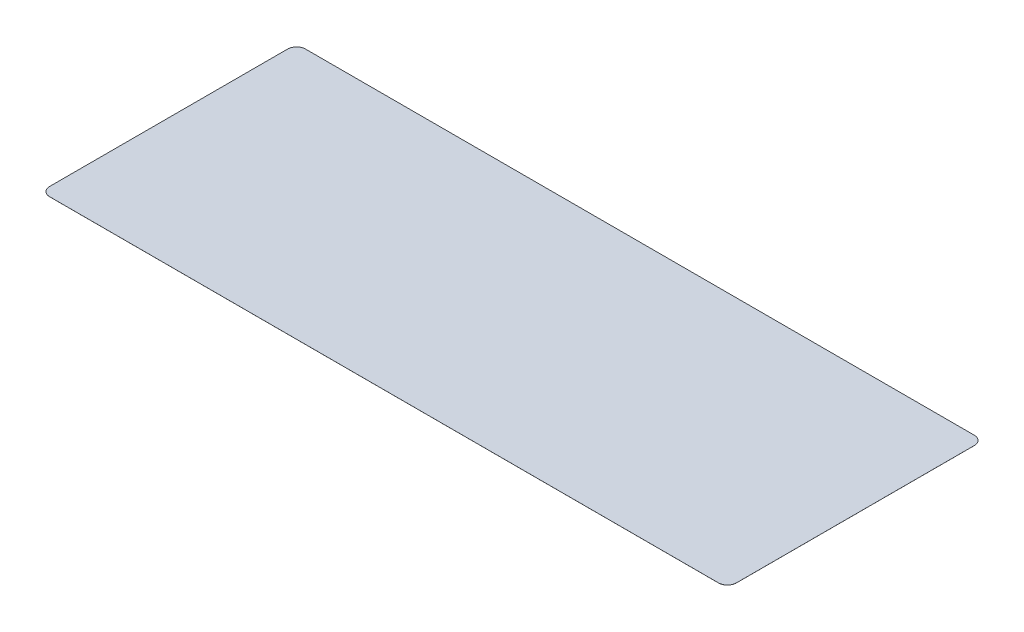
ISO-10303-21;
HEADER;
FILE_DESCRIPTION(('STEP AP214'),'2;1');
FILE_NAME('part.step','',(''),(''),'','','');
FILE_SCHEMA(('AUTOMOTIVE_DESIGN { 1 0 10303 214 1 1 1 1 }'));
ENDSEC;
DATA;
#1=APPLICATION_CONTEXT('core data for automotive mechanical design processes');
#2=APPLICATION_PROTOCOL_DEFINITION('international standard','automotive_design',2000,#1);
#3=PRODUCT_CONTEXT('',#1,'mechanical');
#4=PRODUCT('Part','Part','',(#3));
#5=PRODUCT_RELATED_PRODUCT_CATEGORY('part','',(#4));
#6=PRODUCT_DEFINITION_FORMATION('','',#4);
#7=PRODUCT_DEFINITION_CONTEXT('part definition',#1,'design');
#8=PRODUCT_DEFINITION('design','',#6,#7);
#9=PRODUCT_DEFINITION_SHAPE('','',#8);
#10=(LENGTH_UNIT() NAMED_UNIT(*) SI_UNIT(.MILLI.,.METRE.));
#11=(NAMED_UNIT(*) PLANE_ANGLE_UNIT() SI_UNIT($,.RADIAN.));
#12=(NAMED_UNIT(*) SI_UNIT($,.STERADIAN.) SOLID_ANGLE_UNIT());
#13=UNCERTAINTY_MEASURE_WITH_UNIT(LENGTH_MEASURE(1.E-05),#10,'distance_accuracy_value','');
#14=(GEOMETRIC_REPRESENTATION_CONTEXT(3) GLOBAL_UNCERTAINTY_ASSIGNED_CONTEXT((#13)) GLOBAL_UNIT_ASSIGNED_CONTEXT((#10,
#11,#12)) REPRESENTATION_CONTEXT('',''));
#15=CARTESIAN_POINT('',(0.,0.,0.));
#16=DIRECTION('',(0.,0.,1.));
#17=DIRECTION('',(1.,0.,0.));
#18=AXIS2_PLACEMENT_3D('',#15,#16,#17);
#19=CARTESIAN_POINT('',(946.150000000001,0.127,336.55));
#20=DIRECTION('',(0.,-1.,0.));
#21=DIRECTION('',(0.,0.,-1.));
#22=AXIS2_PLACEMENT_3D('',#19,#20,#21);
#23=CYLINDRICAL_SURFACE('',#22,25.4);
#24=CARTESIAN_POINT('',(946.150000000001,0.,336.55));
#25=DIRECTION('',(0.,1.,0.));
#26=DIRECTION('',(0.,0.,1.));
#27=AXIS2_PLACEMENT_3D('',#24,#25,#26);
#28=CIRCLE('',#27,25.4);
#29=CARTESIAN_POINT('',(946.150000000001,0.,361.95));
#30=VERTEX_POINT('',#29);
#31=CARTESIAN_POINT('',(971.550000000001,0.,336.55));
#32=VERTEX_POINT('',#31);
#33=EDGE_CURVE('E131',#30,#32,#28,.T.);
#34=ORIENTED_EDGE('',*,*,#33,.T.);
#35=DIRECTION('',(0.,-1.,0.));
#36=VECTOR('',#35,1.);
#37=CARTESIAN_POINT('',(971.550000000001,0.127,336.55));
#38=LINE('',#37,#36);
#39=CARTESIAN_POINT('',(971.550000000001,0.127,336.55));
#40=VERTEX_POINT('',#39);
#41=EDGE_CURVE('E11',#40,#32,#38,.T.);
#42=ORIENTED_EDGE('',*,*,#41,.F.);
#43=CARTESIAN_POINT('',(946.150000000001,0.127,336.55));
#44=DIRECTION('',(0.,1.,0.));
#45=DIRECTION('',(0.,0.,1.));
#46=AXIS2_PLACEMENT_3D('',#43,#44,#45);
#47=CIRCLE('',#46,25.4);
#48=CARTESIAN_POINT('',(946.150000000001,0.127,361.95));
#49=VERTEX_POINT('',#48);
#50=EDGE_CURVE('E145',#49,#40,#47,.T.);
#51=ORIENTED_EDGE('',*,*,#50,.F.);
#52=DIRECTION('',(0.,-1.,0.));
#53=VECTOR('',#52,1.);
#54=CARTESIAN_POINT('',(946.150000000001,0.127,361.95));
#55=LINE('',#54,#53);
#56=EDGE_CURVE('E127',#49,#30,#55,.T.);
#57=ORIENTED_EDGE('',*,*,#56,.T.);
#58=EDGE_LOOP('',(#34,#42,#51,#57));
#59=FACE_BOUND('',#58,.T.);
#60=ADVANCED_FACE('F35',(#59),#23,.T.);
#61=CARTESIAN_POINT('',(971.550000000001,0.127,-336.55));
#62=DIRECTION('',(-1.,0.,0.));
#63=DIRECTION('',(0.,0.,1.));
#64=AXIS2_PLACEMENT_3D('',#61,#62,#63);
#65=PLANE('',#64);
#66=DIRECTION('',(0.,0.,-1.));
#67=VECTOR('',#66,1.);
#68=CARTESIAN_POINT('',(971.550000000001,0.,-336.55));
#69=LINE('',#68,#67);
#70=CARTESIAN_POINT('',(971.550000000001,0.,-336.55));
#71=VERTEX_POINT('',#70);
#72=EDGE_CURVE('E134',#32,#71,#69,.T.);
#73=ORIENTED_EDGE('',*,*,#72,.T.);
#74=DIRECTION('',(0.,-1.,0.));
#75=VECTOR('',#74,1.);
#76=CARTESIAN_POINT('',(971.550000000001,0.127,-336.55));
#77=LINE('',#76,#75);
#78=CARTESIAN_POINT('',(971.550000000001,0.127,-336.55));
#79=VERTEX_POINT('',#78);
#80=EDGE_CURVE('E43',#79,#71,#77,.T.);
#81=ORIENTED_EDGE('',*,*,#80,.F.);
#82=DIRECTION('',(0.,0.,-1.));
#83=VECTOR('',#82,1.);
#84=CARTESIAN_POINT('',(971.550000000001,0.127,-336.55));
#85=LINE('',#84,#83);
#86=EDGE_CURVE('E94',#40,#79,#85,.T.);
#87=ORIENTED_EDGE('',*,*,#86,.F.);
#88=ORIENTED_EDGE('',*,*,#41,.T.);
#89=EDGE_LOOP('',(#73,#81,#87,#88));
#90=FACE_BOUND('',#89,.T.);
#91=ADVANCED_FACE('F180',(#90),#65,.F.);
#92=CARTESIAN_POINT('',(946.150000000001,0.127,-336.55));
#93=DIRECTION('',(0.,-1.,0.));
#94=DIRECTION('',(0.,0.,-1.));
#95=AXIS2_PLACEMENT_3D('',#92,#93,#94);
#96=CYLINDRICAL_SURFACE('',#95,25.4);
#97=CARTESIAN_POINT('',(946.150000000001,0.,-336.55));
#98=DIRECTION('',(0.,1.,0.));
#99=DIRECTION('',(0.,0.,1.));
#100=AXIS2_PLACEMENT_3D('',#97,#98,#99);
#101=CIRCLE('',#100,25.4);
#102=CARTESIAN_POINT('',(946.150000000001,0.,-361.95));
#103=VERTEX_POINT('',#102);
#104=EDGE_CURVE('E136',#71,#103,#101,.T.);
#105=ORIENTED_EDGE('',*,*,#104,.T.);
#106=DIRECTION('',(0.,-1.,0.));
#107=VECTOR('',#106,1.);
#108=CARTESIAN_POINT('',(946.150000000001,0.127,-361.95));
#109=LINE('',#108,#107);
#110=CARTESIAN_POINT('',(946.150000000001,0.127,-361.95));
#111=VERTEX_POINT('',#110);
#112=EDGE_CURVE('E152',#111,#103,#109,.T.);
#113=ORIENTED_EDGE('',*,*,#112,.F.);
#114=CARTESIAN_POINT('',(946.150000000001,0.127,-336.55));
#115=DIRECTION('',(0.,1.,0.));
#116=DIRECTION('',(0.,0.,1.));
#117=AXIS2_PLACEMENT_3D('',#114,#115,#116);
#118=CIRCLE('',#117,25.4);
#119=EDGE_CURVE('E160',#79,#111,#118,.T.);
#120=ORIENTED_EDGE('',*,*,#119,.F.);
#121=ORIENTED_EDGE('',*,*,#80,.T.);
#122=EDGE_LOOP('',(#105,#113,#120,#121));
#123=FACE_BOUND('',#122,.T.);
#124=ADVANCED_FACE('F158',(#123),#96,.T.);
#125=CARTESIAN_POINT('',(-946.15,0.127,-361.95));
#126=DIRECTION('',(0.,0.,1.));
#127=DIRECTION('',(1.,0.,0.));
#128=AXIS2_PLACEMENT_3D('',#125,#126,#127);
#129=PLANE('',#128);
#130=DIRECTION('',(-1.,0.,0.));
#131=VECTOR('',#130,1.);
#132=CARTESIAN_POINT('',(-946.15,0.,-361.95));
#133=LINE('',#132,#131);
#134=CARTESIAN_POINT('',(-946.15,0.,-361.95));
#135=VERTEX_POINT('',#134);
#136=EDGE_CURVE('E138',#103,#135,#133,.T.);
#137=ORIENTED_EDGE('',*,*,#136,.T.);
#138=DIRECTION('',(0.,-1.,0.));
#139=VECTOR('',#138,1.);
#140=CARTESIAN_POINT('',(-946.15,0.127,-361.95));
#141=LINE('',#140,#139);
#142=CARTESIAN_POINT('',(-946.15,0.127,-361.95));
#143=VERTEX_POINT('',#142);
#144=EDGE_CURVE('E149',#143,#135,#141,.T.);
#145=ORIENTED_EDGE('',*,*,#144,.F.);
#146=DIRECTION('',(-1.,0.,0.));
#147=VECTOR('',#146,1.);
#148=CARTESIAN_POINT('',(-946.15,0.127,-361.95));
#149=LINE('',#148,#147);
#150=EDGE_CURVE('E172',#111,#143,#149,.T.);
#151=ORIENTED_EDGE('',*,*,#150,.F.);
#152=ORIENTED_EDGE('',*,*,#112,.T.);
#153=EDGE_LOOP('',(#137,#145,#151,#152));
#154=FACE_BOUND('',#153,.T.);
#155=ADVANCED_FACE('F168',(#154),#129,.F.);
#156=CARTESIAN_POINT('',(-946.15,0.127,-336.55));
#157=DIRECTION('',(0.,-1.,0.));
#158=DIRECTION('',(0.,0.,-1.));
#159=AXIS2_PLACEMENT_3D('',#156,#157,#158);
#160=CYLINDRICAL_SURFACE('',#159,25.4);
#161=CARTESIAN_POINT('',(-946.15,0.,-336.55));
#162=DIRECTION('',(0.,1.,0.));
#163=DIRECTION('',(0.,0.,1.));
#164=AXIS2_PLACEMENT_3D('',#161,#162,#163);
#165=CIRCLE('',#164,25.4);
#166=CARTESIAN_POINT('',(-971.55,0.,-336.55));
#167=VERTEX_POINT('',#166);
#168=EDGE_CURVE('E140',#135,#167,#165,.T.);
#169=ORIENTED_EDGE('',*,*,#168,.T.);
#170=DIRECTION('',(0.,-1.,0.));
#171=VECTOR('',#170,1.);
#172=CARTESIAN_POINT('',(-971.55,0.127,-336.55));
#173=LINE('',#172,#171);
#174=CARTESIAN_POINT('',(-971.55,0.127,-336.55));
#175=VERTEX_POINT('',#174);
#176=EDGE_CURVE('E122',#175,#167,#173,.T.);
#177=ORIENTED_EDGE('',*,*,#176,.F.);
#178=CARTESIAN_POINT('',(-946.15,0.127,-336.55));
#179=DIRECTION('',(0.,1.,0.));
#180=DIRECTION('',(0.,0.,1.));
#181=AXIS2_PLACEMENT_3D('',#178,#179,#180);
#182=CIRCLE('',#181,25.4);
#183=EDGE_CURVE('E113',#143,#175,#182,.T.);
#184=ORIENTED_EDGE('',*,*,#183,.F.);
#185=ORIENTED_EDGE('',*,*,#144,.T.);
#186=EDGE_LOOP('',(#169,#177,#184,#185));
#187=FACE_BOUND('',#186,.T.);
#188=ADVANCED_FACE('F171',(#187),#160,.T.);
#189=CARTESIAN_POINT('',(-971.55,0.127,336.55));
#190=DIRECTION('',(1.,0.,0.));
#191=DIRECTION('',(0.,0.,-1.));
#192=AXIS2_PLACEMENT_3D('',#189,#190,#191);
#193=PLANE('',#192);
#194=DIRECTION('',(0.,0.,1.));
#195=VECTOR('',#194,1.);
#196=CARTESIAN_POINT('',(-971.55,0.,336.55));
#197=LINE('',#196,#195);
#198=CARTESIAN_POINT('',(-971.55,0.,336.55));
#199=VERTEX_POINT('',#198);
#200=EDGE_CURVE('E121',#167,#199,#197,.T.);
#201=ORIENTED_EDGE('',*,*,#200,.T.);
#202=DIRECTION('',(0.,-1.,0.));
#203=VECTOR('',#202,1.);
#204=CARTESIAN_POINT('',(-971.55,0.127,336.55));
#205=LINE('',#204,#203);
#206=CARTESIAN_POINT('',(-971.55,0.127,336.55));
#207=VERTEX_POINT('',#206);
#208=EDGE_CURVE('E118',#207,#199,#205,.T.);
#209=ORIENTED_EDGE('',*,*,#208,.F.);
#210=DIRECTION('',(0.,0.,1.));
#211=VECTOR('',#210,1.);
#212=CARTESIAN_POINT('',(-971.55,0.127,336.55));
#213=LINE('',#212,#211);
#214=EDGE_CURVE('E107',#175,#207,#213,.T.);
#215=ORIENTED_EDGE('',*,*,#214,.F.);
#216=ORIENTED_EDGE('',*,*,#176,.T.);
#217=EDGE_LOOP('',(#201,#209,#215,#216));
#218=FACE_BOUND('',#217,.T.);
#219=ADVANCED_FACE('F119',(#218),#193,.F.);
#220=CARTESIAN_POINT('',(-946.15,0.127,336.55));
#221=DIRECTION('',(0.,-1.,0.));
#222=DIRECTION('',(0.,0.,-1.));
#223=AXIS2_PLACEMENT_3D('',#220,#221,#222);
#224=CYLINDRICAL_SURFACE('',#223,25.4);
#225=CARTESIAN_POINT('',(-946.15,0.,336.55));
#226=DIRECTION('',(0.,1.,0.));
#227=DIRECTION('',(0.,0.,1.));
#228=AXIS2_PLACEMENT_3D('',#225,#226,#227);
#229=CIRCLE('',#228,25.4);
#230=CARTESIAN_POINT('',(-946.15,0.,361.95));
#231=VERTEX_POINT('',#230);
#232=EDGE_CURVE('E80',#199,#231,#229,.T.);
#233=ORIENTED_EDGE('',*,*,#232,.T.);
#234=DIRECTION('',(0.,-1.,0.));
#235=VECTOR('',#234,1.);
#236=CARTESIAN_POINT('',(-946.15,0.127,361.95));
#237=LINE('',#236,#235);
#238=CARTESIAN_POINT('',(-946.15,0.127,361.95));
#239=VERTEX_POINT('',#238);
#240=EDGE_CURVE('E123',#239,#231,#237,.T.);
#241=ORIENTED_EDGE('',*,*,#240,.F.);
#242=CARTESIAN_POINT('',(-946.15,0.127,336.55));
#243=DIRECTION('',(0.,1.,0.));
#244=DIRECTION('',(0.,0.,1.));
#245=AXIS2_PLACEMENT_3D('',#242,#243,#244);
#246=CIRCLE('',#245,25.4);
#247=EDGE_CURVE('E111',#207,#239,#246,.T.);
#248=ORIENTED_EDGE('',*,*,#247,.F.);
#249=ORIENTED_EDGE('',*,*,#208,.T.);
#250=EDGE_LOOP('',(#233,#241,#248,#249));
#251=FACE_BOUND('',#250,.T.);
#252=ADVANCED_FACE('F125',(#251),#224,.T.);
#253=CARTESIAN_POINT('',(946.150000000001,0.127,361.95));
#254=DIRECTION('',(0.,0.,-1.));
#255=DIRECTION('',(-1.,0.,0.));
#256=AXIS2_PLACEMENT_3D('',#253,#254,#255);
#257=PLANE('',#256);
#258=DIRECTION('',(1.,0.,0.));
#259=VECTOR('',#258,1.);
#260=CARTESIAN_POINT('',(946.150000000001,0.,361.95));
#261=LINE('',#260,#259);
#262=EDGE_CURVE('E86',#231,#30,#261,.T.);
#263=ORIENTED_EDGE('',*,*,#262,.T.);
#264=ORIENTED_EDGE('',*,*,#56,.F.);
#265=DIRECTION('',(1.,0.,0.));
#266=VECTOR('',#265,1.);
#267=CARTESIAN_POINT('',(946.150000000001,0.127,361.95));
#268=LINE('',#267,#266);
#269=EDGE_CURVE('E51',#239,#49,#268,.T.);
#270=ORIENTED_EDGE('',*,*,#269,.F.);
#271=ORIENTED_EDGE('',*,*,#240,.T.);
#272=EDGE_LOOP('',(#263,#264,#270,#271));
#273=FACE_BOUND('',#272,.T.);
#274=ADVANCED_FACE('F196',(#273),#257,.F.);
#275=CARTESIAN_POINT('',(946.150000000001,0.127,336.55));
#276=DIRECTION('',(0.,1.,0.));
#277=DIRECTION('',(0.,0.,1.));
#278=AXIS2_PLACEMENT_3D('',#275,#276,#277);
#279=PLANE('',#278);
#280=ORIENTED_EDGE('',*,*,#50,.T.);
#281=ORIENTED_EDGE('',*,*,#86,.T.);
#282=ORIENTED_EDGE('',*,*,#119,.T.);
#283=ORIENTED_EDGE('',*,*,#150,.T.);
#284=ORIENTED_EDGE('',*,*,#183,.T.);
#285=ORIENTED_EDGE('',*,*,#214,.T.);
#286=ORIENTED_EDGE('',*,*,#247,.T.);
#287=ORIENTED_EDGE('',*,*,#269,.T.);
#288=EDGE_LOOP('',(#280,#281,#282,#283,#284,#285,#286,#287));
#289=FACE_BOUND('',#288,.T.);
#290=ADVANCED_FACE('F109',(#289),#279,.T.);
#291=CARTESIAN_POINT('',(946.150000000001,0.,336.55));
#292=DIRECTION('',(0.,1.,0.));
#293=DIRECTION('',(0.,0.,1.));
#294=AXIS2_PLACEMENT_3D('',#291,#292,#293);
#295=PLANE('',#294);
#296=ORIENTED_EDGE('',*,*,#33,.F.);
#297=ORIENTED_EDGE('',*,*,#262,.F.);
#298=ORIENTED_EDGE('',*,*,#232,.F.);
#299=ORIENTED_EDGE('',*,*,#200,.F.);
#300=ORIENTED_EDGE('',*,*,#168,.F.);
#301=ORIENTED_EDGE('',*,*,#136,.F.);
#302=ORIENTED_EDGE('',*,*,#104,.F.);
#303=ORIENTED_EDGE('',*,*,#72,.F.);
#304=EDGE_LOOP('',(#296,#297,#298,#299,#300,#301,#302,#303));
#305=FACE_BOUND('',#304,.T.);
#306=ADVANCED_FACE('F164',(#305),#295,.F.);
#307=CLOSED_SHELL('',(#60,#91,#124,#155,#188,#219,#252,#274,#290,#306));
#308=MANIFOLD_SOLID_BREP('B2',#307);
#309=ADVANCED_BREP_SHAPE_REPRESENTATION('',(#18,#308),#14);
#310=SHAPE_DEFINITION_REPRESENTATION(#9,#309);
ENDSEC;
END-ISO-10303-21;
